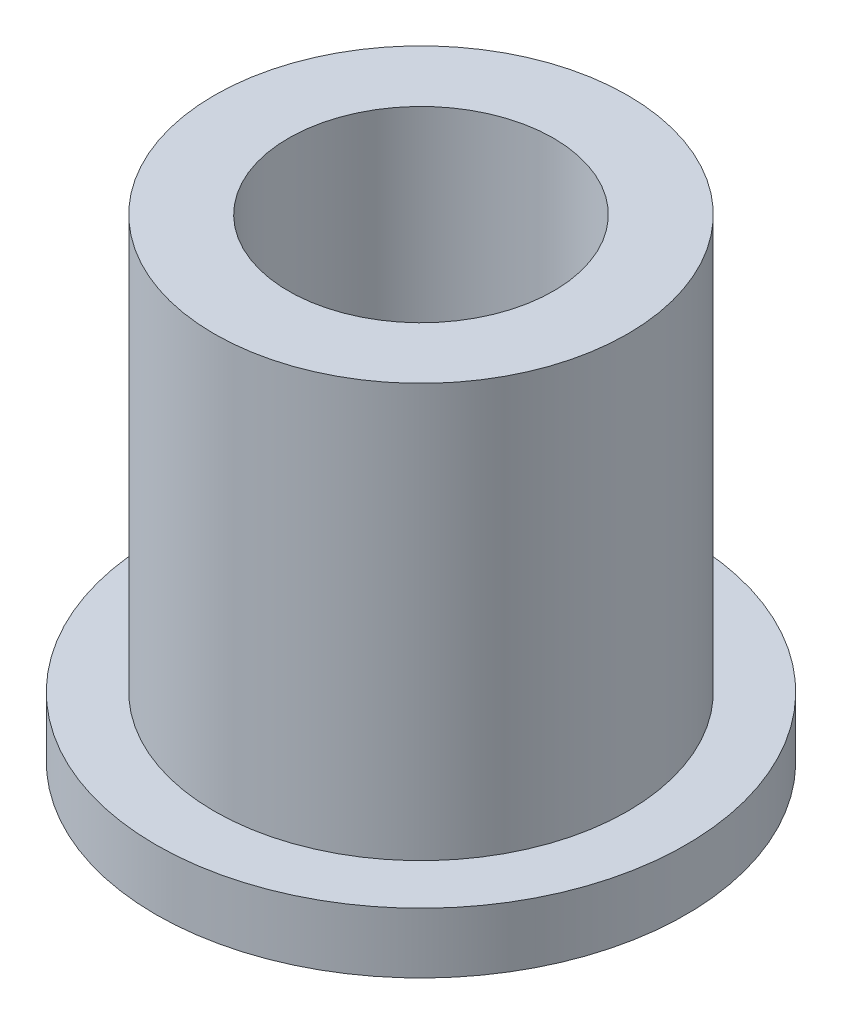
ISO-10303-21;
HEADER;
FILE_DESCRIPTION(('STEP AP214'),'2;1');
FILE_NAME('part.step','',(''),(''),'','','');
FILE_SCHEMA(('AUTOMOTIVE_DESIGN { 1 0 10303 214 1 1 1 1 }'));
ENDSEC;
DATA;
#1=APPLICATION_CONTEXT('core data for automotive mechanical design processes');
#2=APPLICATION_PROTOCOL_DEFINITION('international standard','automotive_design',2000,#1);
#3=PRODUCT_CONTEXT('',#1,'mechanical');
#4=PRODUCT('Part','Part','',(#3));
#5=PRODUCT_RELATED_PRODUCT_CATEGORY('part','',(#4));
#6=PRODUCT_DEFINITION_FORMATION('','',#4);
#7=PRODUCT_DEFINITION_CONTEXT('part definition',#1,'design');
#8=PRODUCT_DEFINITION('design','',#6,#7);
#9=PRODUCT_DEFINITION_SHAPE('','',#8);
#10=(LENGTH_UNIT() NAMED_UNIT(*) SI_UNIT(.MILLI.,.METRE.));
#11=(NAMED_UNIT(*) PLANE_ANGLE_UNIT() SI_UNIT($,.RADIAN.));
#12=(NAMED_UNIT(*) SI_UNIT($,.STERADIAN.) SOLID_ANGLE_UNIT());
#13=UNCERTAINTY_MEASURE_WITH_UNIT(LENGTH_MEASURE(1.E-05),#10,'distance_accuracy_value','');
#14=(GEOMETRIC_REPRESENTATION_CONTEXT(3) GLOBAL_UNCERTAINTY_ASSIGNED_CONTEXT((#13)) GLOBAL_UNIT_ASSIGNED_CONTEXT((#10,
#11,#12)) REPRESENTATION_CONTEXT('',''));
#15=CARTESIAN_POINT('',(0.,0.,0.));
#16=DIRECTION('',(0.,0.,1.));
#17=DIRECTION('',(1.,0.,0.));
#18=AXIS2_PLACEMENT_3D('',#15,#16,#17);
#19=CARTESIAN_POINT('',(0.,0.127,0.));
#20=DIRECTION('',(0.,-1.,0.));
#21=DIRECTION('',(0.,0.,1.));
#22=AXIS2_PLACEMENT_3D('',#19,#20,#21);
#23=SPHERICAL_SURFACE('',#22,0.889);
#24=CARTESIAN_POINT('',(0.,-0.762,0.));
#25=VERTEX_POINT('',#24);
#26=VERTEX_LOOP('',#25);
#27=FACE_BOUND('',#26,.T.);
#28=CARTESIAN_POINT('',(0.,0.,0.));
#29=DIRECTION('',(0.,-1.,0.));
#30=DIRECTION('',(0.,0.,-1.));
#31=AXIS2_PLACEMENT_3D('',#28,#29,#30);
#32=CIRCLE('',#31,0.87988181024499);
#33=CARTESIAN_POINT('',(0.,0.,-0.87988181024499));
#34=VERTEX_POINT('',#33);
#35=EDGE_CURVE('E21',#34,#34,#32,.T.);
#36=ORIENTED_EDGE('',*,*,#35,.T.);
#37=EDGE_LOOP('',(#36));
#38=FACE_BOUND('',#37,.T.);
#39=ADVANCED_FACE('F17',(#27,#38),#23,.T.);
#40=CARTESIAN_POINT('',(0.,0.,0.));
#41=DIRECTION('',(0.,1.,0.));
#42=DIRECTION('',(0.,0.,1.));
#43=AXIS2_PLACEMENT_3D('',#40,#41,#42);
#44=PLANE('',#43);
#45=ORIENTED_EDGE('',*,*,#35,.F.);
#46=EDGE_LOOP('',(#45));
#47=FACE_BOUND('',#46,.T.);
#48=CARTESIAN_POINT('',(0.,0.,0.));
#49=DIRECTION('',(0.,-1.,0.));
#50=DIRECTION('',(0.,0.,-1.));
#51=AXIS2_PLACEMENT_3D('',#48,#49,#50);
#52=CIRCLE('',#51,6.35);
#53=CARTESIAN_POINT('',(0.,0.,-6.35));
#54=VERTEX_POINT('',#53);
#55=EDGE_CURVE('E35',#54,#54,#52,.F.);
#56=ORIENTED_EDGE('',*,*,#55,.F.);
#57=EDGE_LOOP('',(#56));
#58=FACE_BOUND('',#57,.T.);
#59=ADVANCED_FACE('F31',(#47,#58),#44,.F.);
#60=CARTESIAN_POINT('',(0.,1.4478,0.));
#61=DIRECTION('',(0.,1.,0.));
#62=DIRECTION('',(0.,0.,1.));
#63=AXIS2_PLACEMENT_3D('',#60,#61,#62);
#64=PLANE('',#63);
#65=CARTESIAN_POINT('',(0.,1.44780000000032,0.));
#66=DIRECTION('',(0.,-1.,0.));
#67=DIRECTION('',(0.,0.,-1.));
#68=AXIS2_PLACEMENT_3D('',#65,#66,#67);
#69=CIRCLE('',#68,3.175);
#70=CARTESIAN_POINT('',(0.,1.44780000000032,-3.175));
#71=VERTEX_POINT('',#70);
#72=EDGE_CURVE('E37',#71,#71,#69,.F.);
#73=ORIENTED_EDGE('',*,*,#72,.T.);
#74=EDGE_LOOP('',(#73));
#75=FACE_BOUND('',#74,.T.);
#76=ADVANCED_FACE('F65',(#75),#64,.T.);
#77=CARTESIAN_POINT('',(0.,1.476756,0.));
#78=DIRECTION('',(0.,-1.,0.));
#79=DIRECTION('',(0.,0.,-1.));
#80=AXIS2_PLACEMENT_3D('',#77,#78,#79);
#81=CYLINDRICAL_SURFACE('',#80,6.35);
#82=CARTESIAN_POINT('',(0.,1.4478,0.));
#83=DIRECTION('',(0.,-1.,0.));
#84=DIRECTION('',(0.,0.,-1.));
#85=AXIS2_PLACEMENT_3D('',#82,#83,#84);
#86=CIRCLE('',#85,6.35);
#87=CARTESIAN_POINT('',(0.,1.4478,-6.35));
#88=VERTEX_POINT('',#87);
#89=EDGE_CURVE('E41',#88,#88,#86,.F.);
#90=ORIENTED_EDGE('',*,*,#89,.F.);
#91=EDGE_LOOP('',(#90));
#92=FACE_BOUND('',#91,.T.);
#93=ORIENTED_EDGE('',*,*,#55,.T.);
#94=EDGE_LOOP('',(#93));
#95=FACE_BOUND('',#94,.T.);
#96=ADVANCED_FACE('F63',(#92,#95),#81,.T.);
#97=CARTESIAN_POINT('',(0.,11.55192,0.));
#98=DIRECTION('',(0.,-1.,0.));
#99=DIRECTION('',(0.,0.,-1.));
#100=AXIS2_PLACEMENT_3D('',#97,#98,#99);
#101=CYLINDRICAL_SURFACE('',#100,3.175);
#102=CARTESIAN_POINT('',(0.,11.3538,0.));
#103=DIRECTION('',(0.,-1.,0.));
#104=DIRECTION('',(0.,0.,-1.));
#105=AXIS2_PLACEMENT_3D('',#102,#103,#104);
#106=CIRCLE('',#105,3.175);
#107=CARTESIAN_POINT('',(0.,11.3538,-3.175));
#108=VERTEX_POINT('',#107);
#109=EDGE_CURVE('E46',#108,#108,#106,.T.);
#110=ORIENTED_EDGE('',*,*,#109,.F.);
#111=EDGE_LOOP('',(#110));
#112=FACE_BOUND('',#111,.T.);
#113=ORIENTED_EDGE('',*,*,#72,.F.);
#114=EDGE_LOOP('',(#113));
#115=FACE_BOUND('',#114,.T.);
#116=ADVANCED_FACE('F59',(#112,#115),#101,.F.);
#117=CARTESIAN_POINT('',(0.,1.4478,0.));
#118=DIRECTION('',(0.,1.,0.));
#119=DIRECTION('',(0.,0.,1.));
#120=AXIS2_PLACEMENT_3D('',#117,#118,#119);
#121=PLANE('',#120);
#122=CARTESIAN_POINT('',(0.,1.44780000000032,0.));
#123=DIRECTION('',(0.,-1.,0.));
#124=DIRECTION('',(0.,0.,-1.));
#125=AXIS2_PLACEMENT_3D('',#122,#123,#124);
#126=CIRCLE('',#125,4.953);
#127=CARTESIAN_POINT('',(0.,1.44780000000032,-4.953));
#128=VERTEX_POINT('',#127);
#129=EDGE_CURVE('E25',#128,#128,#126,.F.);
#130=ORIENTED_EDGE('',*,*,#129,.F.);
#131=EDGE_LOOP('',(#130));
#132=FACE_BOUND('',#131,.T.);
#133=ORIENTED_EDGE('',*,*,#89,.T.);
#134=EDGE_LOOP('',(#133));
#135=FACE_BOUND('',#134,.T.);
#136=ADVANCED_FACE('F55',(#132,#135),#121,.T.);
#137=CARTESIAN_POINT('',(0.,11.3538,0.));
#138=DIRECTION('',(0.,1.,0.));
#139=DIRECTION('',(0.,0.,1.));
#140=AXIS2_PLACEMENT_3D('',#137,#138,#139);
#141=PLANE('',#140);
#142=ORIENTED_EDGE('',*,*,#109,.T.);
#143=EDGE_LOOP('',(#142));
#144=FACE_BOUND('',#143,.T.);
#145=CARTESIAN_POINT('',(0.,11.3538,0.));
#146=DIRECTION('',(0.,-1.,0.));
#147=DIRECTION('',(0.,0.,-1.));
#148=AXIS2_PLACEMENT_3D('',#145,#146,#147);
#149=CIRCLE('',#148,4.953);
#150=CARTESIAN_POINT('',(0.,11.3538,-4.953));
#151=VERTEX_POINT('',#150);
#152=EDGE_CURVE('E11',#151,#151,#149,.T.);
#153=ORIENTED_EDGE('',*,*,#152,.F.);
#154=EDGE_LOOP('',(#153));
#155=FACE_BOUND('',#154,.T.);
#156=ADVANCED_FACE('F58',(#144,#155),#141,.T.);
#157=CARTESIAN_POINT('',(0.,11.55192,0.));
#158=DIRECTION('',(0.,-1.,0.));
#159=DIRECTION('',(0.,0.,-1.));
#160=AXIS2_PLACEMENT_3D('',#157,#158,#159);
#161=CYLINDRICAL_SURFACE('',#160,4.953);
#162=ORIENTED_EDGE('',*,*,#152,.T.);
#163=EDGE_LOOP('',(#162));
#164=FACE_BOUND('',#163,.T.);
#165=ORIENTED_EDGE('',*,*,#129,.T.);
#166=EDGE_LOOP('',(#165));
#167=FACE_BOUND('',#166,.T.);
#168=ADVANCED_FACE('F53',(#164,#167),#161,.T.);
#169=CLOSED_SHELL('',(#39,#59,#76,#96,#116,#136,#156,#168));
#170=MANIFOLD_SOLID_BREP('B1',#169);
#171=ADVANCED_BREP_SHAPE_REPRESENTATION('',(#18,#170),#14);
#172=SHAPE_DEFINITION_REPRESENTATION(#9,#171);
ENDSEC;
END-ISO-10303-21;
